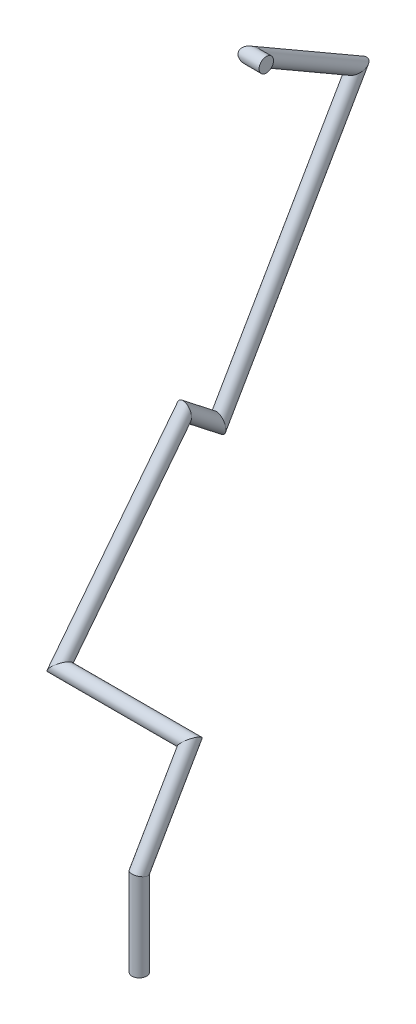
ISO-10303-21;
HEADER;
FILE_DESCRIPTION(('STEP AP214'),'2;1');
FILE_NAME('part.step','',(''),(''),'','','');
FILE_SCHEMA(('AUTOMOTIVE_DESIGN { 1 0 10303 214 1 1 1 1 }'));
ENDSEC;
DATA;
#1=APPLICATION_CONTEXT('core data for automotive mechanical design processes');
#2=APPLICATION_PROTOCOL_DEFINITION('international standard','automotive_design',2000,#1);
#3=PRODUCT_CONTEXT('',#1,'mechanical');
#4=PRODUCT('Part','Part','',(#3));
#5=PRODUCT_RELATED_PRODUCT_CATEGORY('part','',(#4));
#6=PRODUCT_DEFINITION_FORMATION('','',#4);
#7=PRODUCT_DEFINITION_CONTEXT('part definition',#1,'design');
#8=PRODUCT_DEFINITION('design','',#6,#7);
#9=PRODUCT_DEFINITION_SHAPE('','',#8);
#10=(LENGTH_UNIT() NAMED_UNIT(*) SI_UNIT(.MILLI.,.METRE.));
#11=(NAMED_UNIT(*) PLANE_ANGLE_UNIT() SI_UNIT($,.RADIAN.));
#12=(NAMED_UNIT(*) SI_UNIT($,.STERADIAN.) SOLID_ANGLE_UNIT());
#13=UNCERTAINTY_MEASURE_WITH_UNIT(LENGTH_MEASURE(1.E-05),#10,'distance_accuracy_value','');
#14=(GEOMETRIC_REPRESENTATION_CONTEXT(3) GLOBAL_UNCERTAINTY_ASSIGNED_CONTEXT((#13)) GLOBAL_UNIT_ASSIGNED_CONTEXT((#10,
#11,#12)) REPRESENTATION_CONTEXT('',''));
#15=CARTESIAN_POINT('',(0.,0.,0.));
#16=DIRECTION('',(0.,0.,1.));
#17=DIRECTION('',(1.,0.,0.));
#18=AXIS2_PLACEMENT_3D('',#15,#16,#17);
#19=CARTESIAN_POINT('',(-40.0000000000001,210.375158518347,-84.0433976179507));
#20=DIRECTION('',(-1.,0.,0.));
#21=DIRECTION('',(0.,0.,1.));
#22=AXIS2_PLACEMENT_3D('',#19,#20,#21);
#23=PLANE('',#22);
#24=CARTESIAN_POINT('',(-40.0000000000001,210.375158518347,-84.0433976179507));
#25=DIRECTION('',(-1.,0.,0.));
#26=DIRECTION('',(0.,0.,1.));
#27=AXIS2_PLACEMENT_3D('',#24,#25,#26);
#28=CIRCLE('',#27,2.5);
#29=CARTESIAN_POINT('',(-40.0000000000001,210.375158518347,-81.5433976179507));
#30=VERTEX_POINT('',#29);
#31=EDGE_CURVE('E48',#30,#30,#28,.T.);
#32=ORIENTED_EDGE('',*,*,#31,.F.);
#33=EDGE_LOOP('',(#32));
#34=FACE_BOUND('',#33,.T.);
#35=ADVANCED_FACE('F45',(#34),#23,.F.);
#36=CARTESIAN_POINT('',(0.,0.,0.));
#37=DIRECTION('',(0.,-1.,0.));
#38=DIRECTION('',(-0.788010753606725,0.,0.615661475325655));
#39=AXIS2_PLACEMENT_3D('',#36,#37,#38);
#40=PLANE('',#39);
#41=CARTESIAN_POINT('',(0.,0.,0.));
#42=DIRECTION('',(0.,-1.,0.));
#43=DIRECTION('',(-0.788010753606725,0.,0.615661475325655));
#44=AXIS2_PLACEMENT_3D('',#41,#42,#43);
#45=CIRCLE('',#44,2.5);
#46=CARTESIAN_POINT('',(-1.97002688401685,0.,1.53915368831419));
#47=VERTEX_POINT('',#46);
#48=EDGE_CURVE('E53',#47,#47,#45,.T.);
#49=ORIENTED_EDGE('',*,*,#48,.T.);
#50=EDGE_LOOP('',(#49));
#51=FACE_BOUND('',#50,.T.);
#52=ADVANCED_FACE('F92',(#51),#40,.T.);
#53=CARTESIAN_POINT('',(-50.2315698604074,210.375158518347,-84.0433976179507));
#54=DIRECTION('',(1.,0.,0.));
#55=DIRECTION('',(0.,0.,-1.));
#56=AXIS2_PLACEMENT_3D('',#53,#54,#55);
#57=CYLINDRICAL_SURFACE('',#56,2.5);
#58=CARTESIAN_POINT('',(-45.0000000000001,210.375158518347,-84.0433976179507));
#59=DIRECTION('',(0.707106781186546,0.353553390593274,0.612372435695796));
#60=DIRECTION('',(-0.707106781186549,0.353553390593272,0.612372435695794));
#61=AXIS2_PLACEMENT_3D('',#58,#59,#60);
#62=ELLIPSE('',#61,3.53553390593275,2.5);
#63=CARTESIAN_POINT('',(-47.5000000000001,211.625158518347,-81.8783341084896));
#64=VERTEX_POINT('',#63);
#65=EDGE_CURVE('E80',#64,#64,#62,.T.);
#66=ORIENTED_EDGE('',*,*,#65,.T.);
#67=EDGE_LOOP('',(#66));
#68=FACE_BOUND('',#67,.T.);
#69=ORIENTED_EDGE('',*,*,#31,.T.);
#70=EDGE_LOOP('',(#69));
#71=FACE_BOUND('',#70,.T.);
#72=ADVANCED_FACE('F89',(#68,#71),#57,.T.);
#73=CARTESIAN_POINT('',(-45.,186.25608865794,-125.818852047479));
#74=DIRECTION('',(0.,0.499999999999999,0.866025403784439));
#75=DIRECTION('',(0.,-0.866025403784439,0.499999999999999));
#76=AXIS2_PLACEMENT_3D('',#73,#74,#75);
#77=CYLINDRICAL_SURFACE('',#76,2.5);
#78=CARTESIAN_POINT('',(-45.,189.375158518347,-120.416464576897));
#79=DIRECTION('',(0.,0.965925826289068,0.258819045102521));
#80=DIRECTION('',(0.,0.258819045102521,-0.965925826289068));
#81=AXIS2_PLACEMENT_3D('',#78,#79,#80);
#82=ELLIPSE('',#81,3.53553390593274,2.5);
#83=CARTESIAN_POINT('',(-45.,190.290222027808,-123.831528086358));
#84=VERTEX_POINT('',#83);
#85=EDGE_CURVE('E77',#84,#84,#82,.T.);
#86=ORIENTED_EDGE('',*,*,#85,.T.);
#87=EDGE_LOOP('',(#86));
#88=FACE_BOUND('',#87,.T.);
#89=ORIENTED_EDGE('',*,*,#65,.F.);
#90=EDGE_LOOP('',(#89));
#91=FACE_BOUND('',#90,.T.);
#92=ADVANCED_FACE('F124',(#88,#91),#77,.T.);
#93=CARTESIAN_POINT('',(-45.,100.035006171375,-68.8359035699304));
#94=DIRECTION('',(0.,0.866025403784438,-0.500000000000001));
#95=DIRECTION('',(0.,0.500000000000001,0.866025403784438));
#96=AXIS2_PLACEMENT_3D('',#93,#94,#95);
#97=CYLINDRICAL_SURFACE('',#96,2.5);
#98=CARTESIAN_POINT('',(-45.,106.236719755041,-72.416464576897));
#99=DIRECTION('',(0.,0.190808995376544,-0.981627183447664));
#100=DIRECTION('',(0.,-0.981627183447664,-0.190808995376544));
#101=AXIS2_PLACEMENT_3D('',#98,#99,#100);
#102=ELLIPSE('',#101,3.81063271676453,2.5);
#103=CARTESIAN_POINT('',(-45.,102.49609909413,-73.1435675773318));
#104=VERTEX_POINT('',#103);
#105=EDGE_CURVE('E73',#104,#104,#102,.T.);
#106=ORIENTED_EDGE('',*,*,#105,.T.);
#107=EDGE_LOOP('',(#106));
#108=FACE_BOUND('',#107,.T.);
#109=ORIENTED_EDGE('',*,*,#85,.F.);
#110=EDGE_LOOP('',(#109));
#111=FACE_BOUND('',#110,.T.);
#112=ADVANCED_FACE('F120',(#108,#111),#97,.T.);
#113=CARTESIAN_POINT('',(-45.,119.31222418873,-55.6805820902932));
#114=DIRECTION('',(0.,-0.615661475325658,-0.788010753606722));
#115=DIRECTION('',(0.,0.788010753606722,-0.615661475325658));
#116=AXIS2_PLACEMENT_3D('',#113,#114,#115);
#117=CYLINDRICAL_SURFACE('',#116,2.5);
#118=CARTESIAN_POINT('',(-45.,115.471641884926,-60.5963032727962));
#119=DIRECTION('',(0.,0.121869343405147,-0.992546151641322));
#120=DIRECTION('',(0.,0.992546151641322,0.121869343405147));
#121=AXIS2_PLACEMENT_3D('',#118,#119,#120);
#122=ELLIPSE('',#121,3.53553390593274,2.5);
#123=CARTESIAN_POINT('',(-45.,118.980822457257,-60.1654300770935));
#124=VERTEX_POINT('',#123);
#125=EDGE_CURVE('E69',#124,#124,#122,.T.);
#126=ORIENTED_EDGE('',*,*,#125,.T.);
#127=EDGE_LOOP('',(#126));
#128=FACE_BOUND('',#127,.T.);
#129=ORIENTED_EDGE('',*,*,#105,.F.);
#130=EDGE_LOOP('',(#129));
#131=FACE_BOUND('',#130,.T.);
#132=ADVANCED_FACE('F116',(#128,#131),#117,.T.);
#133=CARTESIAN_POINT('',(-45.,56.1883558242097,-14.2791239814725));
#134=DIRECTION('',(0.,0.788010753606721,-0.615661475325659));
#135=DIRECTION('',(0.,0.615661475325659,0.788010753606721));
#136=AXIS2_PLACEMENT_3D('',#133,#134,#135);
#137=CYLINDRICAL_SURFACE('',#136,2.5);
#138=CARTESIAN_POINT('',(-45.,60.3108891324553,-17.5));
#139=DIRECTION('',(-0.707106781186548,0.557207747523234,-0.435338404118088));
#140=DIRECTION('',(-0.707106781186547,-0.557207747523234,0.435338404118088));
#141=AXIS2_PLACEMENT_3D('',#138,#139,#140);
#142=ELLIPSE('',#141,3.53553390593274,2.5);
#143=CARTESIAN_POINT('',(-47.5,58.3408622484385,-15.9608463116858));
#144=VERTEX_POINT('',#143);
#145=EDGE_CURVE('E65',#144,#144,#142,.T.);
#146=ORIENTED_EDGE('',*,*,#145,.T.);
#147=EDGE_LOOP('',(#146));
#148=FACE_BOUND('',#147,.T.);
#149=ORIENTED_EDGE('',*,*,#125,.F.);
#150=EDGE_LOOP('',(#149));
#151=FACE_BOUND('',#150,.T.);
#152=ADVANCED_FACE('F112',(#148,#151),#137,.T.);
#153=CARTESIAN_POINT('',(5.65316768670956,60.3108891324553,-17.5));
#154=DIRECTION('',(-1.,0.,0.));
#155=DIRECTION('',(0.,0.,1.));
#156=AXIS2_PLACEMENT_3D('',#153,#154,#155);
#157=CYLINDRICAL_SURFACE('',#156,2.5);
#158=CARTESIAN_POINT('',(0.,60.3108891324553,-17.5));
#159=DIRECTION('',(-0.707106781186547,0.612372435695794,-0.353553390593274));
#160=DIRECTION('',(0.707106781186548,0.612372435695794,-0.353553390593275));
#161=AXIS2_PLACEMENT_3D('',#158,#159,#160);
#162=ELLIPSE('',#161,3.53553390593274,2.5);
#163=CARTESIAN_POINT('',(2.49999999999998,62.4759526419164,-18.75));
#164=VERTEX_POINT('',#163);
#165=EDGE_CURVE('E59',#164,#164,#162,.T.);
#166=ORIENTED_EDGE('',*,*,#165,.T.);
#167=EDGE_LOOP('',(#166));
#168=FACE_BOUND('',#167,.T.);
#169=ORIENTED_EDGE('',*,*,#145,.F.);
#170=EDGE_LOOP('',(#169));
#171=FACE_BOUND('',#170,.T.);
#172=ADVANCED_FACE('F105',(#168,#171),#157,.T.);
#173=CARTESIAN_POINT('',(0.,28.5147974930304,0.857482067200072));
#174=DIRECTION('',(0.,0.866025403784438,-0.500000000000001));
#175=DIRECTION('',(0.,0.500000000000001,0.866025403784438));
#176=AXIS2_PLACEMENT_3D('',#173,#174,#175);
#177=CYLINDRICAL_SURFACE('',#176,2.5);
#178=CARTESIAN_POINT('',(0.,30.,0.));
#179=DIRECTION('',(0.,0.965925826289068,-0.258819045102521));
#180=DIRECTION('',(0.,0.258819045102521,0.965925826289068));
#181=AXIS2_PLACEMENT_3D('',#178,#179,#180);
#182=ELLIPSE('',#181,2.58819045102521,2.5);
#183=CARTESIAN_POINT('',(0.,30.6698729810778,2.50000000000006));
#184=VERTEX_POINT('',#183);
#185=EDGE_CURVE('E11',#184,#184,#182,.T.);
#186=ORIENTED_EDGE('',*,*,#185,.T.);
#187=EDGE_LOOP('',(#186));
#188=FACE_BOUND('',#187,.T.);
#189=ORIENTED_EDGE('',*,*,#165,.F.);
#190=EDGE_LOOP('',(#189));
#191=FACE_BOUND('',#190,.T.);
#192=ADVANCED_FACE('F99',(#188,#191),#177,.T.);
#193=CARTESIAN_POINT('',(0.,0.,0.));
#194=DIRECTION('',(0.,1.,0.));
#195=DIRECTION('',(0.,0.,1.));
#196=AXIS2_PLACEMENT_3D('',#193,#194,#195);
#197=CYLINDRICAL_SURFACE('',#196,2.5);
#198=ORIENTED_EDGE('',*,*,#48,.F.);
#199=EDGE_LOOP('',(#198));
#200=FACE_BOUND('',#199,.T.);
#201=ORIENTED_EDGE('',*,*,#185,.F.);
#202=EDGE_LOOP('',(#201));
#203=FACE_BOUND('',#202,.T.);
#204=ADVANCED_FACE('F97',(#200,#203),#197,.T.);
#205=CLOSED_SHELL('',(#35,#52,#72,#92,#112,#132,#152,#172,#192,#204));
#206=MANIFOLD_SOLID_BREP('B2',#205);
#207=ADVANCED_BREP_SHAPE_REPRESENTATION('',(#18,#206),#14);
#208=SHAPE_DEFINITION_REPRESENTATION(#9,#207);
ENDSEC;
END-ISO-10303-21;
